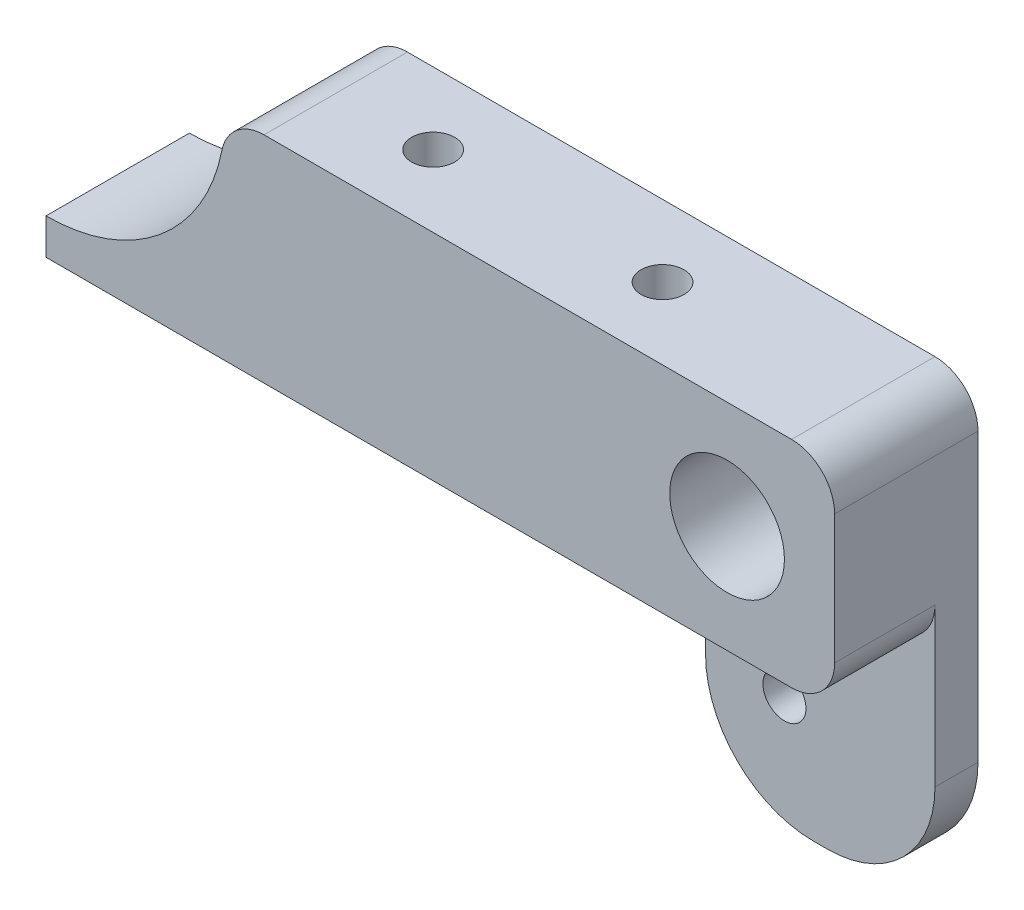
ISO-10303-21;
HEADER;
FILE_DESCRIPTION(('STEP AP214'),'2;1');
FILE_NAME('part.step','',(''),(''),'','','');
FILE_SCHEMA(('AUTOMOTIVE_DESIGN { 1 0 10303 214 1 1 1 1 }'));
ENDSEC;
DATA;
#1=APPLICATION_CONTEXT('core data for automotive mechanical design processes');
#2=APPLICATION_PROTOCOL_DEFINITION('international standard','automotive_design',2000,#1);
#3=PRODUCT_CONTEXT('',#1,'mechanical');
#4=PRODUCT('Part','Part','',(#3));
#5=PRODUCT_RELATED_PRODUCT_CATEGORY('part','',(#4));
#6=PRODUCT_DEFINITION_FORMATION('','',#4);
#7=PRODUCT_DEFINITION_CONTEXT('part definition',#1,'design');
#8=PRODUCT_DEFINITION('design','',#6,#7);
#9=PRODUCT_DEFINITION_SHAPE('','',#8);
#10=(LENGTH_UNIT() NAMED_UNIT(*) SI_UNIT(.MILLI.,.METRE.));
#11=(NAMED_UNIT(*) PLANE_ANGLE_UNIT() SI_UNIT($,.RADIAN.));
#12=(NAMED_UNIT(*) SI_UNIT($,.STERADIAN.) SOLID_ANGLE_UNIT());
#13=UNCERTAINTY_MEASURE_WITH_UNIT(LENGTH_MEASURE(1.E-05),#10,'distance_accuracy_value','');
#14=(GEOMETRIC_REPRESENTATION_CONTEXT(3) GLOBAL_UNCERTAINTY_ASSIGNED_CONTEXT((#13)) GLOBAL_UNIT_ASSIGNED_CONTEXT((#10,
#11,#12)) REPRESENTATION_CONTEXT('',''));
#15=CARTESIAN_POINT('',(0.,0.,0.));
#16=DIRECTION('',(0.,0.,1.));
#17=DIRECTION('',(1.,0.,0.));
#18=AXIS2_PLACEMENT_3D('',#15,#16,#17);
#19=CARTESIAN_POINT('',(-47.5,-7.5,10.));
#20=DIRECTION('',(0.,1.,0.));
#21=DIRECTION('',(0.,0.,1.));
#22=AXIS2_PLACEMENT_3D('',#19,#20,#21);
#23=PLANE('',#22);
#24=CARTESIAN_POINT('',(-25.5,-7.5,5.));
#25=DIRECTION('',(0.,1.,0.));
#26=DIRECTION('',(0.,0.,1.));
#27=AXIS2_PLACEMENT_3D('',#24,#25,#26);
#28=CIRCLE('',#27,1.5);
#29=CARTESIAN_POINT('',(-25.5,-7.5,6.5));
#30=VERTEX_POINT('',#29);
#31=EDGE_CURVE('E263',#30,#30,#28,.F.);
#32=ORIENTED_EDGE('',*,*,#31,.F.);
#33=EDGE_LOOP('',(#32));
#34=FACE_BOUND('',#33,.T.);
#35=CARTESIAN_POINT('',(-9.5,-7.5,5.));
#36=DIRECTION('',(0.,1.,0.));
#37=DIRECTION('',(0.,0.,1.));
#38=AXIS2_PLACEMENT_3D('',#35,#36,#37);
#39=CIRCLE('',#38,1.5);
#40=CARTESIAN_POINT('',(-9.5,-7.5,6.5));
#41=VERTEX_POINT('',#40);
#42=EDGE_CURVE('E266',#41,#41,#39,.F.);
#43=ORIENTED_EDGE('',*,*,#42,.F.);
#44=EDGE_LOOP('',(#43));
#45=FACE_BOUND('',#44,.T.);
#46=DIRECTION('',(-1.,0.,0.));
#47=VECTOR('',#46,1.);
#48=CARTESIAN_POINT('',(7.5,-7.5,3.));
#49=LINE('',#48,#47);
#50=CARTESIAN_POINT('',(4.5,-7.5,3.));
#51=VERTEX_POINT('',#50);
#52=CARTESIAN_POINT('',(-11.5,-7.5,3.));
#53=VERTEX_POINT('',#52);
#54=EDGE_CURVE('E228',#51,#53,#49,.T.);
#55=ORIENTED_EDGE('',*,*,#54,.F.);
#56=DIRECTION('',(0.,0.,-1.));
#57=VECTOR('',#56,1.);
#58=CARTESIAN_POINT('',(4.5,-7.5,10.));
#59=LINE('',#58,#57);
#60=CARTESIAN_POINT('',(4.5,-7.5,10.));
#61=VERTEX_POINT('',#60);
#62=EDGE_CURVE('E40',#51,#61,#59,.F.);
#63=ORIENTED_EDGE('',*,*,#62,.T.);
#64=DIRECTION('',(1.,0.,0.));
#65=VECTOR('',#64,1.);
#66=CARTESIAN_POINT('',(-47.5,-7.5,10.));
#67=LINE('',#66,#65);
#68=CARTESIAN_POINT('',(-47.5,-7.5,10.));
#69=VERTEX_POINT('',#68);
#70=EDGE_CURVE('E157',#69,#61,#67,.T.);
#71=ORIENTED_EDGE('',*,*,#70,.F.);
#72=DIRECTION('',(0.,0.,-1.));
#73=VECTOR('',#72,1.);
#74=CARTESIAN_POINT('',(-47.5,-7.5,10.));
#75=LINE('',#74,#73);
#76=CARTESIAN_POINT('',(-47.5,-7.5,0.));
#77=VERTEX_POINT('',#76);
#78=EDGE_CURVE('E152',#69,#77,#75,.T.);
#79=ORIENTED_EDGE('',*,*,#78,.T.);
#80=DIRECTION('',(1.,0.,0.));
#81=VECTOR('',#80,1.);
#82=CARTESIAN_POINT('',(-47.5,-7.5,0.));
#83=LINE('',#82,#81);
#84=CARTESIAN_POINT('',(-11.5,-7.5,0.));
#85=VERTEX_POINT('',#84);
#86=EDGE_CURVE('E172',#77,#85,#83,.T.);
#87=ORIENTED_EDGE('',*,*,#86,.T.);
#88=DIRECTION('',(0.,0.,-1.));
#89=VECTOR('',#88,1.);
#90=CARTESIAN_POINT('',(-11.5,-7.5,3.));
#91=LINE('',#90,#89);
#92=EDGE_CURVE('E199',#85,#53,#91,.F.);
#93=ORIENTED_EDGE('',*,*,#92,.T.);
#94=EDGE_LOOP('',(#55,#63,#71,#79,#87,#93));
#95=FACE_BOUND('',#94,.T.);
#96=ADVANCED_FACE('F32',(#34,#45,#95),#23,.F.);
#97=CARTESIAN_POINT('',(-47.5,7.5,10.));
#98=DIRECTION('',(0.,0.,1.));
#99=DIRECTION('',(1.,0.,0.));
#100=AXIS2_PLACEMENT_3D('',#97,#98,#99);
#101=PLANE('',#100);
#102=DIRECTION('',(-1.,0.,0.));
#103=VECTOR('',#102,1.);
#104=CARTESIAN_POINT('',(-35.,7.5,10.));
#105=LINE('',#104,#103);
#106=CARTESIAN_POINT('',(4.5,7.5,10.));
#107=VERTEX_POINT('',#106);
#108=CARTESIAN_POINT('',(-32.2930936742545,7.5,10.));
#109=VERTEX_POINT('',#108);
#110=EDGE_CURVE('E142',#107,#109,#105,.T.);
#111=ORIENTED_EDGE('',*,*,#110,.T.);
#112=CARTESIAN_POINT('',(-32.2930936742545,4.5,10.));
#113=DIRECTION('',(0.,0.,1.));
#114=DIRECTION('',(1.,0.,0.));
#115=AXIS2_PLACEMENT_3D('',#112,#113,#114);
#116=CIRCLE('',#115,3.);
#117=CARTESIAN_POINT('',(-35.2363658663342,5.08064516129032,10.));
#118=VERTEX_POINT('',#117);
#119=EDGE_CURVE('E138',#109,#118,#116,.T.);
#120=ORIENTED_EDGE('',*,*,#119,.T.);
#121=CARTESIAN_POINT('',(-47.5,7.5,10.));
#122=DIRECTION('',(0.,0.,-1.));
#123=DIRECTION('',(1.,0.,0.));
#124=AXIS2_PLACEMENT_3D('',#121,#122,#123);
#125=CIRCLE('',#124,12.5);
#126=CARTESIAN_POINT('',(-47.5,-5.,10.));
#127=VERTEX_POINT('',#126);
#128=EDGE_CURVE('E128',#118,#127,#125,.T.);
#129=ORIENTED_EDGE('',*,*,#128,.T.);
#130=DIRECTION('',(0.,-1.,0.));
#131=VECTOR('',#130,1.);
#132=CARTESIAN_POINT('',(-47.5,-5.,10.));
#133=LINE('',#132,#131);
#134=EDGE_CURVE('E135',#127,#69,#133,.T.);
#135=ORIENTED_EDGE('',*,*,#134,.T.);
#136=ORIENTED_EDGE('',*,*,#70,.T.);
#137=CARTESIAN_POINT('',(4.5,-4.5,10.));
#138=DIRECTION('',(0.,0.,1.));
#139=DIRECTION('',(1.,0.,0.));
#140=AXIS2_PLACEMENT_3D('',#137,#138,#139);
#141=CIRCLE('',#140,3.);
#142=CARTESIAN_POINT('',(7.5,-4.5,10.));
#143=VERTEX_POINT('',#142);
#144=EDGE_CURVE('E219',#61,#143,#141,.T.);
#145=ORIENTED_EDGE('',*,*,#144,.T.);
#146=DIRECTION('',(0.,1.,0.));
#147=VECTOR('',#146,1.);
#148=CARTESIAN_POINT('',(7.5,7.5,10.));
#149=LINE('',#148,#147);
#150=CARTESIAN_POINT('',(7.5,4.5,10.));
#151=VERTEX_POINT('',#150);
#152=EDGE_CURVE('E175',#143,#151,#149,.T.);
#153=ORIENTED_EDGE('',*,*,#152,.T.);
#154=CARTESIAN_POINT('',(4.5,4.5,10.));
#155=DIRECTION('',(0.,0.,1.));
#156=DIRECTION('',(1.,0.,0.));
#157=AXIS2_PLACEMENT_3D('',#154,#155,#156);
#158=CIRCLE('',#157,3.);
#159=EDGE_CURVE('E217',#151,#107,#158,.T.);
#160=ORIENTED_EDGE('',*,*,#159,.T.);
#161=EDGE_LOOP('',(#111,#120,#129,#135,#136,#145,#153,#160));
#162=FACE_BOUND('',#161,.T.);
#163=CARTESIAN_POINT('',(0.,0.,10.));
#164=DIRECTION('',(0.,0.,1.));
#165=DIRECTION('',(1.,0.,0.));
#166=AXIS2_PLACEMENT_3D('',#163,#164,#165);
#167=CIRCLE('',#166,4.);
#168=CARTESIAN_POINT('',(4.,0.,10.));
#169=VERTEX_POINT('',#168);
#170=EDGE_CURVE('E166',#169,#169,#167,.T.);
#171=ORIENTED_EDGE('',*,*,#170,.F.);
#172=EDGE_LOOP('',(#171));
#173=FACE_BOUND('',#172,.T.);
#174=ADVANCED_FACE('F131',(#162,#173),#101,.T.);
#175=CARTESIAN_POINT('',(-47.5,7.5,0.));
#176=DIRECTION('',(0.,0.,1.));
#177=DIRECTION('',(1.,0.,0.));
#178=AXIS2_PLACEMENT_3D('',#175,#176,#177);
#179=PLANE('',#178);
#180=CARTESIAN_POINT('',(-47.5,7.5,0.));
#181=DIRECTION('',(0.,0.,-1.));
#182=DIRECTION('',(1.,0.,0.));
#183=AXIS2_PLACEMENT_3D('',#180,#181,#182);
#184=CIRCLE('',#183,12.5);
#185=CARTESIAN_POINT('',(-35.2363658663342,5.08064516129032,0.));
#186=VERTEX_POINT('',#185);
#187=CARTESIAN_POINT('',(-47.5,-5.,0.));
#188=VERTEX_POINT('',#187);
#189=EDGE_CURVE('E148',#186,#188,#184,.T.);
#190=ORIENTED_EDGE('',*,*,#189,.F.);
#191=CARTESIAN_POINT('',(-32.2930936742545,4.5,0.));
#192=DIRECTION('',(0.,0.,1.));
#193=DIRECTION('',(1.,0.,0.));
#194=AXIS2_PLACEMENT_3D('',#191,#192,#193);
#195=CIRCLE('',#194,3.);
#196=CARTESIAN_POINT('',(-32.2930936742545,7.5,0.));
#197=VERTEX_POINT('',#196);
#198=EDGE_CURVE('E210',#186,#197,#195,.F.);
#199=ORIENTED_EDGE('',*,*,#198,.T.);
#200=DIRECTION('',(-1.,0.,0.));
#201=VECTOR('',#200,1.);
#202=CARTESIAN_POINT('',(-35.,7.5,0.));
#203=LINE('',#202,#201);
#204=CARTESIAN_POINT('',(4.5,7.5,0.));
#205=VERTEX_POINT('',#204);
#206=EDGE_CURVE('E165',#205,#197,#203,.T.);
#207=ORIENTED_EDGE('',*,*,#206,.F.);
#208=CARTESIAN_POINT('',(4.5,4.5,0.));
#209=DIRECTION('',(0.,0.,1.));
#210=DIRECTION('',(1.,0.,0.));
#211=AXIS2_PLACEMENT_3D('',#208,#209,#210);
#212=CIRCLE('',#211,3.);
#213=CARTESIAN_POINT('',(7.5,4.5,0.));
#214=VERTEX_POINT('',#213);
#215=EDGE_CURVE('E208',#205,#214,#212,.F.);
#216=ORIENTED_EDGE('',*,*,#215,.T.);
#217=DIRECTION('',(0.,1.,0.));
#218=VECTOR('',#217,1.);
#219=CARTESIAN_POINT('',(7.5,7.5,0.));
#220=LINE('',#219,#218);
#221=CARTESIAN_POINT('',(7.5,-15.5,0.));
#222=VERTEX_POINT('',#221);
#223=EDGE_CURVE('E162',#222,#214,#220,.T.);
#224=ORIENTED_EDGE('',*,*,#223,.F.);
#225=CARTESIAN_POINT('',(0.,-15.5,0.));
#226=DIRECTION('',(0.,0.,1.));
#227=DIRECTION('',(1.,0.,0.));
#228=AXIS2_PLACEMENT_3D('',#225,#226,#227);
#229=CIRCLE('',#228,7.5);
#230=CARTESIAN_POINT('',(0.,-23.,0.));
#231=VERTEX_POINT('',#230);
#232=EDGE_CURVE('E181',#222,#231,#229,.F.);
#233=ORIENTED_EDGE('',*,*,#232,.T.);
#234=DIRECTION('',(1.,0.,0.));
#235=VECTOR('',#234,1.);
#236=CARTESIAN_POINT('',(7.5,-23.,0.));
#237=LINE('',#236,#235);
#238=CARTESIAN_POINT('',(-0.999999999999997,-23.,0.));
#239=VERTEX_POINT('',#238);
#240=EDGE_CURVE('E248',#239,#231,#237,.T.);
#241=ORIENTED_EDGE('',*,*,#240,.F.);
#242=CARTESIAN_POINT('',(-0.999999999999999,-15.5,0.));
#243=DIRECTION('',(0.,0.,1.));
#244=DIRECTION('',(1.,0.,0.));
#245=AXIS2_PLACEMENT_3D('',#242,#243,#244);
#246=CIRCLE('',#245,7.5);
#247=CARTESIAN_POINT('',(-8.5,-15.5,0.));
#248=VERTEX_POINT('',#247);
#249=EDGE_CURVE('E183',#239,#248,#246,.F.);
#250=ORIENTED_EDGE('',*,*,#249,.T.);
#251=DIRECTION('',(0.,-1.,0.));
#252=VECTOR('',#251,1.);
#253=CARTESIAN_POINT('',(-8.5,-7.5,0.));
#254=LINE('',#253,#252);
#255=CARTESIAN_POINT('',(-8.5,-10.5,0.));
#256=VERTEX_POINT('',#255);
#257=EDGE_CURVE('E251',#256,#248,#254,.T.);
#258=ORIENTED_EDGE('',*,*,#257,.F.);
#259=CARTESIAN_POINT('',(-11.5,-10.5,0.));
#260=DIRECTION('',(0.,0.,1.));
#261=DIRECTION('',(1.,0.,0.));
#262=AXIS2_PLACEMENT_3D('',#259,#260,#261);
#263=CIRCLE('',#262,3.);
#264=EDGE_CURVE('E202',#256,#85,#263,.T.);
#265=ORIENTED_EDGE('',*,*,#264,.T.);
#266=ORIENTED_EDGE('',*,*,#86,.F.);
#267=DIRECTION('',(0.,-1.,0.));
#268=VECTOR('',#267,1.);
#269=CARTESIAN_POINT('',(-47.5,-5.,0.));
#270=LINE('',#269,#268);
#271=EDGE_CURVE('E170',#188,#77,#270,.T.);
#272=ORIENTED_EDGE('',*,*,#271,.F.);
#273=EDGE_LOOP('',(#190,#199,#207,#216,#224,#233,#241,#250,#258,#265,#266,#272));
#274=FACE_BOUND('',#273,.T.);
#275=CARTESIAN_POINT('',(0.,0.,0.));
#276=DIRECTION('',(0.,0.,1.));
#277=DIRECTION('',(1.,0.,0.));
#278=AXIS2_PLACEMENT_3D('',#275,#276,#277);
#279=CIRCLE('',#278,4.);
#280=CARTESIAN_POINT('',(4.,0.,0.));
#281=VERTEX_POINT('',#280);
#282=EDGE_CURVE('E242',#281,#281,#279,.T.);
#283=ORIENTED_EDGE('',*,*,#282,.T.);
#284=EDGE_LOOP('',(#283));
#285=FACE_BOUND('',#284,.T.);
#286=CARTESIAN_POINT('',(-3.,-15.25,0.));
#287=DIRECTION('',(0.,0.,1.));
#288=DIRECTION('',(1.,0.,0.));
#289=AXIS2_PLACEMENT_3D('',#286,#287,#288);
#290=CIRCLE('',#289,1.5);
#291=CARTESIAN_POINT('',(-1.5,-15.25,0.));
#292=VERTEX_POINT('',#291);
#293=EDGE_CURVE('E260',#292,#292,#290,.T.);
#294=ORIENTED_EDGE('',*,*,#293,.T.);
#295=EDGE_LOOP('',(#294));
#296=FACE_BOUND('',#295,.T.);
#297=ADVANCED_FACE('F293',(#274,#285,#296),#179,.F.);
#298=CARTESIAN_POINT('',(7.5,7.5,10.));
#299=DIRECTION('',(-1.,0.,0.));
#300=DIRECTION('',(0.,0.,1.));
#301=AXIS2_PLACEMENT_3D('',#298,#299,#300);
#302=PLANE('',#301);
#303=ORIENTED_EDGE('',*,*,#152,.F.);
#304=DIRECTION('',(0.,0.,-1.));
#305=VECTOR('',#304,1.);
#306=CARTESIAN_POINT('',(7.5,-4.5,10.));
#307=LINE('',#306,#305);
#308=CARTESIAN_POINT('',(7.5,-4.5,3.));
#309=VERTEX_POINT('',#308);
#310=EDGE_CURVE('E224',#143,#309,#307,.T.);
#311=ORIENTED_EDGE('',*,*,#310,.T.);
#312=DIRECTION('',(0.,1.,0.));
#313=VECTOR('',#312,1.);
#314=CARTESIAN_POINT('',(7.5,-7.5,3.));
#315=LINE('',#314,#313);
#316=CARTESIAN_POINT('',(7.5,-15.5,3.));
#317=VERTEX_POINT('',#316);
#318=EDGE_CURVE('E50',#317,#309,#315,.T.);
#319=ORIENTED_EDGE('',*,*,#318,.F.);
#320=DIRECTION('',(0.,0.,-1.));
#321=VECTOR('',#320,1.);
#322=CARTESIAN_POINT('',(7.5,-15.5,10.));
#323=LINE('',#322,#321);
#324=EDGE_CURVE('E193',#317,#222,#323,.T.);
#325=ORIENTED_EDGE('',*,*,#324,.T.);
#326=ORIENTED_EDGE('',*,*,#223,.T.);
#327=DIRECTION('',(0.,0.,-1.));
#328=VECTOR('',#327,1.);
#329=CARTESIAN_POINT('',(7.5,4.5,10.));
#330=LINE('',#329,#328);
#331=EDGE_CURVE('E222',#214,#151,#330,.F.);
#332=ORIENTED_EDGE('',*,*,#331,.T.);
#333=EDGE_LOOP('',(#303,#311,#319,#325,#326,#332));
#334=FACE_BOUND('',#333,.T.);
#335=ADVANCED_FACE('F236',(#334),#302,.F.);
#336=CARTESIAN_POINT('',(-35.,7.5,10.));
#337=DIRECTION('',(0.,-1.,0.));
#338=DIRECTION('',(0.,0.,-1.));
#339=AXIS2_PLACEMENT_3D('',#336,#337,#338);
#340=PLANE('',#339);
#341=CARTESIAN_POINT('',(-25.5,7.5,5.));
#342=DIRECTION('',(0.,1.,0.));
#343=DIRECTION('',(0.,0.,1.));
#344=AXIS2_PLACEMENT_3D('',#341,#342,#343);
#345=CIRCLE('',#344,1.5);
#346=CARTESIAN_POINT('',(-25.5,7.5,6.5));
#347=VERTEX_POINT('',#346);
#348=EDGE_CURVE('E269',#347,#347,#345,.T.);
#349=ORIENTED_EDGE('',*,*,#348,.F.);
#350=EDGE_LOOP('',(#349));
#351=FACE_BOUND('',#350,.T.);
#352=CARTESIAN_POINT('',(-9.5,7.5,5.));
#353=DIRECTION('',(0.,1.,0.));
#354=DIRECTION('',(0.,0.,1.));
#355=AXIS2_PLACEMENT_3D('',#352,#353,#354);
#356=CIRCLE('',#355,1.5);
#357=CARTESIAN_POINT('',(-9.5,7.5,6.5));
#358=VERTEX_POINT('',#357);
#359=EDGE_CURVE('E270',#358,#358,#356,.T.);
#360=ORIENTED_EDGE('',*,*,#359,.F.);
#361=EDGE_LOOP('',(#360));
#362=FACE_BOUND('',#361,.T.);
#363=ORIENTED_EDGE('',*,*,#206,.T.);
#364=DIRECTION('',(0.,0.,-1.));
#365=VECTOR('',#364,1.);
#366=CARTESIAN_POINT('',(-32.2930936742545,7.5,10.));
#367=LINE('',#366,#365);
#368=EDGE_CURVE('E215',#197,#109,#367,.F.);
#369=ORIENTED_EDGE('',*,*,#368,.T.);
#370=ORIENTED_EDGE('',*,*,#110,.F.);
#371=DIRECTION('',(0.,0.,-1.));
#372=VECTOR('',#371,1.);
#373=CARTESIAN_POINT('',(4.5,7.5,10.));
#374=LINE('',#373,#372);
#375=EDGE_CURVE('E212',#107,#205,#374,.T.);
#376=ORIENTED_EDGE('',*,*,#375,.T.);
#377=EDGE_LOOP('',(#363,#369,#370,#376));
#378=FACE_BOUND('',#377,.T.);
#379=ADVANCED_FACE('F280',(#351,#362,#378),#340,.F.);
#380=CARTESIAN_POINT('',(-47.5,7.5,10.));
#381=DIRECTION('',(0.,0.,-1.));
#382=DIRECTION('',(-1.,0.,0.));
#383=AXIS2_PLACEMENT_3D('',#380,#381,#382);
#384=CYLINDRICAL_SURFACE('',#383,12.5);
#385=ORIENTED_EDGE('',*,*,#128,.F.);
#386=DIRECTION('',(0.,0.,-1.));
#387=VECTOR('',#386,1.);
#388=CARTESIAN_POINT('',(-35.2363658663342,5.08064516129032,10.));
#389=LINE('',#388,#387);
#390=EDGE_CURVE('E206',#118,#186,#389,.T.);
#391=ORIENTED_EDGE('',*,*,#390,.T.);
#392=ORIENTED_EDGE('',*,*,#189,.T.);
#393=DIRECTION('',(0.,0.,-1.));
#394=VECTOR('',#393,1.);
#395=CARTESIAN_POINT('',(-47.5,-5.,10.));
#396=LINE('',#395,#394);
#397=EDGE_CURVE('E145',#127,#188,#396,.T.);
#398=ORIENTED_EDGE('',*,*,#397,.F.);
#399=EDGE_LOOP('',(#385,#391,#392,#398));
#400=FACE_BOUND('',#399,.T.);
#401=ADVANCED_FACE('F146',(#400),#384,.F.);
#402=CARTESIAN_POINT('',(-47.5,-5.,10.));
#403=DIRECTION('',(1.,0.,0.));
#404=DIRECTION('',(0.,1.,0.));
#405=AXIS2_PLACEMENT_3D('',#402,#403,#404);
#406=PLANE('',#405);
#407=ORIENTED_EDGE('',*,*,#271,.T.);
#408=ORIENTED_EDGE('',*,*,#78,.F.);
#409=ORIENTED_EDGE('',*,*,#134,.F.);
#410=ORIENTED_EDGE('',*,*,#397,.T.);
#411=EDGE_LOOP('',(#407,#408,#409,#410));
#412=FACE_BOUND('',#411,.T.);
#413=ADVANCED_FACE('F154',(#412),#406,.F.);
#414=CARTESIAN_POINT('',(0.,0.,10.));
#415=DIRECTION('',(0.,0.,-1.));
#416=DIRECTION('',(-1.,0.,0.));
#417=AXIS2_PLACEMENT_3D('',#414,#415,#416);
#418=CYLINDRICAL_SURFACE('',#417,4.);
#419=ORIENTED_EDGE('',*,*,#170,.T.);
#420=EDGE_LOOP('',(#419));
#421=FACE_BOUND('',#420,.T.);
#422=ORIENTED_EDGE('',*,*,#282,.F.);
#423=EDGE_LOOP('',(#422));
#424=FACE_BOUND('',#423,.T.);
#425=ADVANCED_FACE('F339',(#421,#424),#418,.F.);
#426=CARTESIAN_POINT('',(0.,0.,3.));
#427=DIRECTION('',(0.,0.,-1.));
#428=DIRECTION('',(-1.,0.,0.));
#429=AXIS2_PLACEMENT_3D('',#426,#427,#428);
#430=PLANE('',#429);
#431=ORIENTED_EDGE('',*,*,#318,.T.);
#432=CARTESIAN_POINT('',(4.5,-4.5,3.));
#433=DIRECTION('',(0.,0.,-1.));
#434=DIRECTION('',(-1.,0.,0.));
#435=AXIS2_PLACEMENT_3D('',#432,#433,#434);
#436=CIRCLE('',#435,3.);
#437=EDGE_CURVE('E11',#309,#51,#436,.T.);
#438=ORIENTED_EDGE('',*,*,#437,.T.);
#439=ORIENTED_EDGE('',*,*,#54,.T.);
#440=CARTESIAN_POINT('',(-11.5,-10.5,3.));
#441=DIRECTION('',(0.,0.,-1.));
#442=DIRECTION('',(-1.,0.,0.));
#443=AXIS2_PLACEMENT_3D('',#440,#441,#442);
#444=CIRCLE('',#443,3.);
#445=CARTESIAN_POINT('',(-8.5,-10.5,3.));
#446=VERTEX_POINT('',#445);
#447=EDGE_CURVE('E204',#53,#446,#444,.T.);
#448=ORIENTED_EDGE('',*,*,#447,.T.);
#449=DIRECTION('',(0.,-1.,0.));
#450=VECTOR('',#449,1.);
#451=CARTESIAN_POINT('',(-8.5,-7.5,3.));
#452=LINE('',#451,#450);
#453=CARTESIAN_POINT('',(-8.5,-15.5,3.));
#454=VERTEX_POINT('',#453);
#455=EDGE_CURVE('E256',#446,#454,#452,.T.);
#456=ORIENTED_EDGE('',*,*,#455,.T.);
#457=CARTESIAN_POINT('',(-0.999999999999999,-15.5,3.));
#458=DIRECTION('',(0.,0.,-1.));
#459=DIRECTION('',(-1.,0.,0.));
#460=AXIS2_PLACEMENT_3D('',#457,#458,#459);
#461=CIRCLE('',#460,7.5);
#462=CARTESIAN_POINT('',(-0.999999999999997,-23.,3.));
#463=VERTEX_POINT('',#462);
#464=EDGE_CURVE('E191',#454,#463,#461,.F.);
#465=ORIENTED_EDGE('',*,*,#464,.T.);
#466=DIRECTION('',(1.,0.,0.));
#467=VECTOR('',#466,1.);
#468=CARTESIAN_POINT('',(7.5,-23.,3.));
#469=LINE('',#468,#467);
#470=CARTESIAN_POINT('',(0.,-23.,3.));
#471=VERTEX_POINT('',#470);
#472=EDGE_CURVE('E245',#463,#471,#469,.T.);
#473=ORIENTED_EDGE('',*,*,#472,.T.);
#474=CARTESIAN_POINT('',(0.,-15.5,3.));
#475=DIRECTION('',(0.,0.,-1.));
#476=DIRECTION('',(-1.,0.,0.));
#477=AXIS2_PLACEMENT_3D('',#474,#475,#476);
#478=CIRCLE('',#477,7.5);
#479=EDGE_CURVE('E189',#471,#317,#478,.F.);
#480=ORIENTED_EDGE('',*,*,#479,.T.);
#481=EDGE_LOOP('',(#431,#438,#439,#448,#456,#465,#473,#480));
#482=FACE_BOUND('',#481,.T.);
#483=CARTESIAN_POINT('',(-3.,-15.25,3.));
#484=DIRECTION('',(0.,0.,1.));
#485=DIRECTION('',(1.,0.,0.));
#486=AXIS2_PLACEMENT_3D('',#483,#484,#485);
#487=CIRCLE('',#486,1.5);
#488=CARTESIAN_POINT('',(-1.5,-15.25,3.));
#489=VERTEX_POINT('',#488);
#490=EDGE_CURVE('E253',#489,#489,#487,.T.);
#491=ORIENTED_EDGE('',*,*,#490,.F.);
#492=EDGE_LOOP('',(#491));
#493=FACE_BOUND('',#492,.T.);
#494=ADVANCED_FACE('F302',(#482,#493),#430,.F.);
#495=CARTESIAN_POINT('',(-8.5,-7.5,3.));
#496=DIRECTION('',(1.,0.,0.));
#497=DIRECTION('',(0.,1.,0.));
#498=AXIS2_PLACEMENT_3D('',#495,#496,#497);
#499=PLANE('',#498);
#500=ORIENTED_EDGE('',*,*,#455,.F.);
#501=DIRECTION('',(0.,0.,-1.));
#502=VECTOR('',#501,1.);
#503=CARTESIAN_POINT('',(-8.5,-10.5,0.));
#504=LINE('',#503,#502);
#505=EDGE_CURVE('E196',#446,#256,#504,.T.);
#506=ORIENTED_EDGE('',*,*,#505,.T.);
#507=ORIENTED_EDGE('',*,*,#257,.T.);
#508=DIRECTION('',(0.,0.,-1.));
#509=VECTOR('',#508,1.);
#510=CARTESIAN_POINT('',(-8.5,-15.5,3.));
#511=LINE('',#510,#509);
#512=EDGE_CURVE('E186',#248,#454,#511,.F.);
#513=ORIENTED_EDGE('',*,*,#512,.T.);
#514=EDGE_LOOP('',(#500,#506,#507,#513));
#515=FACE_BOUND('',#514,.T.);
#516=ADVANCED_FACE('F305',(#515),#499,.F.);
#517=CARTESIAN_POINT('',(7.5,-23.,3.));
#518=DIRECTION('',(0.,1.,0.));
#519=DIRECTION('',(-1.,0.,0.));
#520=AXIS2_PLACEMENT_3D('',#517,#518,#519);
#521=PLANE('',#520);
#522=ORIENTED_EDGE('',*,*,#472,.F.);
#523=DIRECTION('',(0.,0.,-1.));
#524=VECTOR('',#523,1.);
#525=CARTESIAN_POINT('',(-0.999999999999997,-23.,3.));
#526=LINE('',#525,#524);
#527=EDGE_CURVE('E178',#463,#239,#526,.T.);
#528=ORIENTED_EDGE('',*,*,#527,.T.);
#529=ORIENTED_EDGE('',*,*,#240,.T.);
#530=DIRECTION('',(0.,0.,-1.));
#531=VECTOR('',#530,1.);
#532=CARTESIAN_POINT('',(0.,-23.,3.));
#533=LINE('',#532,#531);
#534=EDGE_CURVE('E151',#231,#471,#533,.F.);
#535=ORIENTED_EDGE('',*,*,#534,.T.);
#536=EDGE_LOOP('',(#522,#528,#529,#535));
#537=FACE_BOUND('',#536,.T.);
#538=ADVANCED_FACE('F315',(#537),#521,.F.);
#539=CARTESIAN_POINT('',(-3.,-15.25,3.));
#540=DIRECTION('',(0.,0.,-1.));
#541=DIRECTION('',(-1.,0.,0.));
#542=AXIS2_PLACEMENT_3D('',#539,#540,#541);
#543=CYLINDRICAL_SURFACE('',#542,1.5);
#544=ORIENTED_EDGE('',*,*,#490,.T.);
#545=EDGE_LOOP('',(#544));
#546=FACE_BOUND('',#545,.T.);
#547=ORIENTED_EDGE('',*,*,#293,.F.);
#548=EDGE_LOOP('',(#547));
#549=FACE_BOUND('',#548,.T.);
#550=ADVANCED_FACE('F346',(#546,#549),#543,.F.);
#551=CARTESIAN_POINT('',(-0.999999999999999,-15.5,3.));
#552=DIRECTION('',(0.,0.,-1.));
#553=DIRECTION('',(-1.,0.,0.));
#554=AXIS2_PLACEMENT_3D('',#551,#552,#553);
#555=CYLINDRICAL_SURFACE('',#554,7.5);
#556=ORIENTED_EDGE('',*,*,#464,.F.);
#557=ORIENTED_EDGE('',*,*,#512,.F.);
#558=ORIENTED_EDGE('',*,*,#249,.F.);
#559=ORIENTED_EDGE('',*,*,#527,.F.);
#560=EDGE_LOOP('',(#556,#557,#558,#559));
#561=FACE_BOUND('',#560,.T.);
#562=ADVANCED_FACE('F311',(#561),#555,.T.);
#563=CARTESIAN_POINT('',(0.,-15.5,10.));
#564=DIRECTION('',(0.,0.,-1.));
#565=DIRECTION('',(-1.,0.,0.));
#566=AXIS2_PLACEMENT_3D('',#563,#564,#565);
#567=CYLINDRICAL_SURFACE('',#566,7.5);
#568=ORIENTED_EDGE('',*,*,#479,.F.);
#569=ORIENTED_EDGE('',*,*,#534,.F.);
#570=ORIENTED_EDGE('',*,*,#232,.F.);
#571=ORIENTED_EDGE('',*,*,#324,.F.);
#572=EDGE_LOOP('',(#568,#569,#570,#571));
#573=FACE_BOUND('',#572,.T.);
#574=ADVANCED_FACE('F319',(#573),#567,.T.);
#575=CARTESIAN_POINT('',(-11.5,-10.5,3.));
#576=DIRECTION('',(0.,0.,1.));
#577=DIRECTION('',(1.,0.,0.));
#578=AXIS2_PLACEMENT_3D('',#575,#576,#577);
#579=CYLINDRICAL_SURFACE('',#578,3.);
#580=ORIENTED_EDGE('',*,*,#447,.F.);
#581=ORIENTED_EDGE('',*,*,#92,.F.);
#582=ORIENTED_EDGE('',*,*,#264,.F.);
#583=ORIENTED_EDGE('',*,*,#505,.F.);
#584=EDGE_LOOP('',(#580,#581,#582,#583));
#585=FACE_BOUND('',#584,.T.);
#586=ADVANCED_FACE('F299',(#585),#579,.F.);
#587=CARTESIAN_POINT('',(-9.5,-11.7426406871193,5.));
#588=DIRECTION('',(0.,1.,0.));
#589=DIRECTION('',(0.,0.,1.));
#590=AXIS2_PLACEMENT_3D('',#587,#588,#589);
#591=CYLINDRICAL_SURFACE('',#590,1.5);
#592=ORIENTED_EDGE('',*,*,#42,.T.);
#593=EDGE_LOOP('',(#592));
#594=FACE_BOUND('',#593,.T.);
#595=ORIENTED_EDGE('',*,*,#359,.T.);
#596=EDGE_LOOP('',(#595));
#597=FACE_BOUND('',#596,.T.);
#598=ADVANCED_FACE('F351',(#594,#597),#591,.F.);
#599=CARTESIAN_POINT('',(-25.5,-11.7426406871193,5.));
#600=DIRECTION('',(0.,1.,0.));
#601=DIRECTION('',(0.,0.,1.));
#602=AXIS2_PLACEMENT_3D('',#599,#600,#601);
#603=CYLINDRICAL_SURFACE('',#602,1.5);
#604=ORIENTED_EDGE('',*,*,#31,.T.);
#605=EDGE_LOOP('',(#604));
#606=FACE_BOUND('',#605,.T.);
#607=ORIENTED_EDGE('',*,*,#348,.T.);
#608=EDGE_LOOP('',(#607));
#609=FACE_BOUND('',#608,.T.);
#610=ADVANCED_FACE('F278',(#606,#609),#603,.F.);
#611=CARTESIAN_POINT('',(-32.2930936742545,4.5,10.));
#612=DIRECTION('',(0.,0.,-1.));
#613=DIRECTION('',(-1.,0.,0.));
#614=AXIS2_PLACEMENT_3D('',#611,#612,#613);
#615=CYLINDRICAL_SURFACE('',#614,3.);
#616=ORIENTED_EDGE('',*,*,#119,.F.);
#617=ORIENTED_EDGE('',*,*,#368,.F.);
#618=ORIENTED_EDGE('',*,*,#198,.F.);
#619=ORIENTED_EDGE('',*,*,#390,.F.);
#620=EDGE_LOOP('',(#616,#617,#618,#619));
#621=FACE_BOUND('',#620,.T.);
#622=ADVANCED_FACE('F292',(#621),#615,.T.);
#623=CARTESIAN_POINT('',(4.5,-4.5,10.));
#624=DIRECTION('',(0.,0.,-1.));
#625=DIRECTION('',(-1.,0.,0.));
#626=AXIS2_PLACEMENT_3D('',#623,#624,#625);
#627=CYLINDRICAL_SURFACE('',#626,3.);
#628=ORIENTED_EDGE('',*,*,#144,.F.);
#629=ORIENTED_EDGE('',*,*,#62,.F.);
#630=ORIENTED_EDGE('',*,*,#437,.F.);
#631=ORIENTED_EDGE('',*,*,#310,.F.);
#632=EDGE_LOOP('',(#628,#629,#630,#631));
#633=FACE_BOUND('',#632,.T.);
#634=ADVANCED_FACE('F234',(#633),#627,.T.);
#635=CARTESIAN_POINT('',(4.5,4.5,10.));
#636=DIRECTION('',(0.,0.,-1.));
#637=DIRECTION('',(-1.,0.,0.));
#638=AXIS2_PLACEMENT_3D('',#635,#636,#637);
#639=CYLINDRICAL_SURFACE('',#638,3.);
#640=ORIENTED_EDGE('',*,*,#159,.F.);
#641=ORIENTED_EDGE('',*,*,#331,.F.);
#642=ORIENTED_EDGE('',*,*,#215,.F.);
#643=ORIENTED_EDGE('',*,*,#375,.F.);
#644=EDGE_LOOP('',(#640,#641,#642,#643));
#645=FACE_BOUND('',#644,.T.);
#646=ADVANCED_FACE('F34',(#645),#639,.T.);
#647=CLOSED_SHELL('',(#96,#174,#297,#335,#379,#401,#413,#425,#494,#516,#538,#550,#562,#574,#586,
#598,#610,#622,#634,#646));
#648=MANIFOLD_SOLID_BREP('B2',#647);
#649=ADVANCED_BREP_SHAPE_REPRESENTATION('',(#18,#648),#14);
#650=SHAPE_DEFINITION_REPRESENTATION(#9,#649);
ENDSEC;
END-ISO-10303-21;
